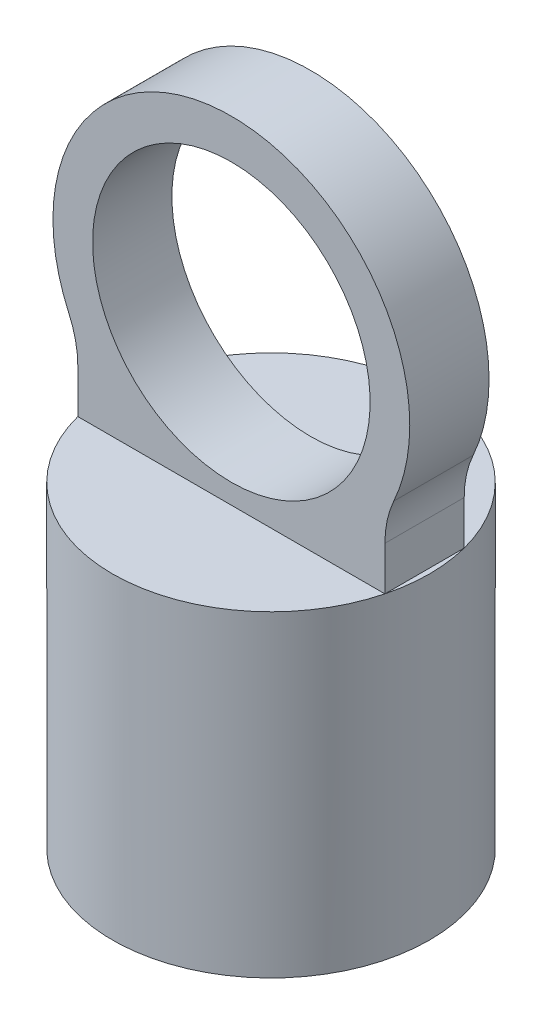
ISO-10303-21;
HEADER;
FILE_DESCRIPTION(('STEP AP214'),'2;1');
FILE_NAME('part.step','',(''),(''),'','','');
FILE_SCHEMA(('AUTOMOTIVE_DESIGN { 1 0 10303 214 1 1 1 1 }'));
ENDSEC;
DATA;
#1=APPLICATION_CONTEXT('core data for automotive mechanical design processes');
#2=APPLICATION_PROTOCOL_DEFINITION('international standard','automotive_design',2000,#1);
#3=PRODUCT_CONTEXT('',#1,'mechanical');
#4=PRODUCT('Part','Part','',(#3));
#5=PRODUCT_RELATED_PRODUCT_CATEGORY('part','',(#4));
#6=PRODUCT_DEFINITION_FORMATION('','',#4);
#7=PRODUCT_DEFINITION_CONTEXT('part definition',#1,'design');
#8=PRODUCT_DEFINITION('design','',#6,#7);
#9=PRODUCT_DEFINITION_SHAPE('','',#8);
#10=(LENGTH_UNIT() NAMED_UNIT(*) SI_UNIT(.MILLI.,.METRE.));
#11=(NAMED_UNIT(*) PLANE_ANGLE_UNIT() SI_UNIT($,.RADIAN.));
#12=(NAMED_UNIT(*) SI_UNIT($,.STERADIAN.) SOLID_ANGLE_UNIT());
#13=UNCERTAINTY_MEASURE_WITH_UNIT(LENGTH_MEASURE(1.E-05),#10,'distance_accuracy_value','');
#14=(GEOMETRIC_REPRESENTATION_CONTEXT(3) GLOBAL_UNCERTAINTY_ASSIGNED_CONTEXT((#13)) GLOBAL_UNIT_ASSIGNED_CONTEXT((#10,
#11,#12)) REPRESENTATION_CONTEXT('',''));
#15=CARTESIAN_POINT('',(0.,0.,0.));
#16=DIRECTION('',(0.,0.,1.));
#17=DIRECTION('',(1.,0.,0.));
#18=AXIS2_PLACEMENT_3D('',#15,#16,#17);
#19=CARTESIAN_POINT('',(2.75,0.,0.));
#20=DIRECTION('',(0.,-1.,0.));
#21=DIRECTION('',(0.,0.,-1.));
#22=AXIS2_PLACEMENT_3D('',#19,#20,#21);
#23=PLANE('',#22);
#24=CARTESIAN_POINT('',(0.,0.,0.));
#25=DIRECTION('',(0.,-1.,0.));
#26=DIRECTION('',(1.,0.,0.));
#27=AXIS2_PLACEMENT_3D('',#24,#25,#26);
#28=CIRCLE('',#27,5.5);
#29=CARTESIAN_POINT('',(5.5,0.,0.));
#30=VERTEX_POINT('',#29);
#31=EDGE_CURVE('E20',#30,#30,#28,.T.);
#32=ORIENTED_EDGE('',*,*,#31,.T.);
#33=EDGE_LOOP('',(#32));
#34=FACE_BOUND('',#33,.T.);
#35=ADVANCED_FACE('F17',(#34),#23,.T.);
#36=CARTESIAN_POINT('',(12.7459666924148,5.20859834963491,2.));
#37=DIRECTION('',(0.,0.,-1.));
#38=DIRECTION('',(0.,1.,0.));
#39=AXIS2_PLACEMENT_3D('',#36,#37,#38);
#40=CYLINDRICAL_SURFACE('',#39,5.);
#41=DIRECTION('',(0.,0.,1.));
#42=VECTOR('',#41,1.);
#43=CARTESIAN_POINT('',(7.74596669241484,5.20859834963492,2.));
#44=LINE('',#43,#42);
#45=CARTESIAN_POINT('',(7.74596669241484,5.20859834963491,2.));
#46=VERTEX_POINT('',#45);
#47=CARTESIAN_POINT('',(7.74596669241483,5.20859834963491,-2.));
#48=VERTEX_POINT('',#47);
#49=EDGE_CURVE('E79',#46,#48,#44,.F.);
#50=ORIENTED_EDGE('',*,*,#49,.T.);
#51=CARTESIAN_POINT('',(12.7459666924148,5.20859834963491,-2.));
#52=DIRECTION('',(0.,0.,-1.));
#53=DIRECTION('',(0.,1.,0.));
#54=AXIS2_PLACEMENT_3D('',#51,#52,#53);
#55=CIRCLE('',#54,5.);
#56=CARTESIAN_POINT('',(8.19383573083811,7.27695608190816,-2.));
#57=VERTEX_POINT('',#56);
#58=EDGE_CURVE('E84',#48,#57,#55,.T.);
#59=ORIENTED_EDGE('',*,*,#58,.T.);
#60=DIRECTION('',(0.,0.,-1.));
#61=VECTOR('',#60,1.);
#62=CARTESIAN_POINT('',(8.19383573083811,7.27695608190816,2.));
#63=LINE('',#62,#61);
#64=CARTESIAN_POINT('',(8.19383573083811,7.27695608190816,2.));
#65=VERTEX_POINT('',#64);
#66=EDGE_CURVE('E104',#65,#57,#63,.T.);
#67=ORIENTED_EDGE('',*,*,#66,.F.);
#68=CARTESIAN_POINT('',(12.7459666924148,5.20859834963491,2.));
#69=DIRECTION('',(0.,0.,-1.));
#70=DIRECTION('',(0.,1.,0.));
#71=AXIS2_PLACEMENT_3D('',#68,#69,#70);
#72=CIRCLE('',#71,5.);
#73=EDGE_CURVE('E99',#65,#46,#72,.F.);
#74=ORIENTED_EDGE('',*,*,#73,.T.);
#75=EDGE_LOOP('',(#50,#59,#67,#74));
#76=FACE_BOUND('',#75,.T.);
#77=ADVANCED_FACE('F138',(#76),#40,.F.);
#78=CARTESIAN_POINT('',(0.,11.,2.));
#79=DIRECTION('',(0.,0.,-1.));
#80=DIRECTION('',(0.,1.,0.));
#81=AXIS2_PLACEMENT_3D('',#78,#79,#80);
#82=CYLINDRICAL_SURFACE('',#81,9.);
#83=ORIENTED_EDGE('',*,*,#66,.T.);
#84=CARTESIAN_POINT('',(0.,11.,-2.));
#85=DIRECTION('',(0.,0.,-1.));
#86=DIRECTION('',(0.,1.,0.));
#87=AXIS2_PLACEMENT_3D('',#84,#85,#86);
#88=CIRCLE('',#87,9.);
#89=CARTESIAN_POINT('',(-8.19383573083811,7.27695608190815,-2.));
#90=VERTEX_POINT('',#89);
#91=EDGE_CURVE('E128',#57,#90,#88,.F.);
#92=ORIENTED_EDGE('',*,*,#91,.T.);
#93=DIRECTION('',(0.,0.,-1.));
#94=VECTOR('',#93,1.);
#95=CARTESIAN_POINT('',(-8.19383573083811,7.27695608190815,2.));
#96=LINE('',#95,#94);
#97=CARTESIAN_POINT('',(-8.19383573083811,7.27695608190815,2.));
#98=VERTEX_POINT('',#97);
#99=EDGE_CURVE('E101',#90,#98,#96,.F.);
#100=ORIENTED_EDGE('',*,*,#99,.T.);
#101=CARTESIAN_POINT('',(0.,11.,2.));
#102=DIRECTION('',(0.,0.,-1.));
#103=DIRECTION('',(0.,1.,0.));
#104=AXIS2_PLACEMENT_3D('',#101,#102,#103);
#105=CIRCLE('',#104,9.);
#106=EDGE_CURVE('E76',#98,#65,#105,.T.);
#107=ORIENTED_EDGE('',*,*,#106,.T.);
#108=EDGE_LOOP('',(#83,#92,#100,#107));
#109=FACE_BOUND('',#108,.T.);
#110=ADVANCED_FACE('F133',(#109),#82,.T.);
#111=CARTESIAN_POINT('',(-12.7459666924148,5.2085983496349,2.));
#112=DIRECTION('',(0.,0.,-1.));
#113=DIRECTION('',(0.,1.,0.));
#114=AXIS2_PLACEMENT_3D('',#111,#112,#113);
#115=CYLINDRICAL_SURFACE('',#114,5.);
#116=ORIENTED_EDGE('',*,*,#99,.F.);
#117=CARTESIAN_POINT('',(-12.7459666924148,5.2085983496349,-2.));
#118=DIRECTION('',(0.,0.,-1.));
#119=DIRECTION('',(0.,1.,0.));
#120=AXIS2_PLACEMENT_3D('',#117,#118,#119);
#121=CIRCLE('',#120,5.);
#122=CARTESIAN_POINT('',(-7.74596669241484,5.2085983496349,-2.));
#123=VERTEX_POINT('',#122);
#124=EDGE_CURVE('E83',#90,#123,#121,.T.);
#125=ORIENTED_EDGE('',*,*,#124,.T.);
#126=DIRECTION('',(0.,0.,-1.));
#127=VECTOR('',#126,1.);
#128=CARTESIAN_POINT('',(-7.74596669241484,5.2085983496349,2.));
#129=LINE('',#128,#127);
#130=CARTESIAN_POINT('',(-7.74596669241484,5.2085983496349,2.));
#131=VERTEX_POINT('',#130);
#132=EDGE_CURVE('E80',#123,#131,#129,.F.);
#133=ORIENTED_EDGE('',*,*,#132,.T.);
#134=CARTESIAN_POINT('',(-12.7459666924148,5.2085983496349,2.));
#135=DIRECTION('',(0.,0.,-1.));
#136=DIRECTION('',(0.,1.,0.));
#137=AXIS2_PLACEMENT_3D('',#134,#135,#136);
#138=CIRCLE('',#137,5.);
#139=EDGE_CURVE('E68',#131,#98,#138,.F.);
#140=ORIENTED_EDGE('',*,*,#139,.T.);
#141=EDGE_LOOP('',(#116,#125,#133,#140));
#142=FACE_BOUND('',#141,.T.);
#143=ADVANCED_FACE('F81',(#142),#115,.F.);
#144=CARTESIAN_POINT('',(0.,11.,40.5675933075855));
#145=DIRECTION('',(0.,0.,-1.));
#146=DIRECTION('',(0.,1.,0.));
#147=AXIS2_PLACEMENT_3D('',#144,#145,#146);
#148=CYLINDRICAL_SURFACE('',#147,7.);
#149=CARTESIAN_POINT('',(0.,11.,-2.));
#150=DIRECTION('',(0.,0.,-1.));
#151=DIRECTION('',(0.,1.,0.));
#152=AXIS2_PLACEMENT_3D('',#149,#150,#151);
#153=CIRCLE('',#152,7.);
#154=CARTESIAN_POINT('',(0.,18.,-2.));
#155=VERTEX_POINT('',#154);
#156=EDGE_CURVE('E123',#155,#155,#153,.T.);
#157=ORIENTED_EDGE('',*,*,#156,.T.);
#158=EDGE_LOOP('',(#157));
#159=FACE_BOUND('',#158,.T.);
#160=CARTESIAN_POINT('',(0.,11.,2.));
#161=DIRECTION('',(0.,0.,-1.));
#162=DIRECTION('',(0.,1.,0.));
#163=AXIS2_PLACEMENT_3D('',#160,#161,#162);
#164=CIRCLE('',#163,7.);
#165=CARTESIAN_POINT('',(0.,18.,2.));
#166=VERTEX_POINT('',#165);
#167=EDGE_CURVE('E90',#166,#166,#164,.F.);
#168=ORIENTED_EDGE('',*,*,#167,.T.);
#169=EDGE_LOOP('',(#168));
#170=FACE_BOUND('',#169,.T.);
#171=ADVANCED_FACE('F244',(#159,#170),#148,.F.);
#172=CARTESIAN_POINT('',(0.,-6.5,0.));
#173=DIRECTION('',(0.,-1.,0.));
#174=DIRECTION('',(1.,0.,0.));
#175=AXIS2_PLACEMENT_3D('',#172,#173,#174);
#176=CYLINDRICAL_SURFACE('',#175,5.5);
#177=CARTESIAN_POINT('',(0.,-13.,0.));
#178=DIRECTION('',(0.,-1.,0.));
#179=DIRECTION('',(1.,0.,0.));
#180=AXIS2_PLACEMENT_3D('',#177,#178,#179);
#181=CIRCLE('',#180,5.5);
#182=CARTESIAN_POINT('',(5.5,-13.,0.));
#183=VERTEX_POINT('',#182);
#184=EDGE_CURVE('E119',#183,#183,#181,.F.);
#185=ORIENTED_EDGE('',*,*,#184,.F.);
#186=EDGE_LOOP('',(#185));
#187=FACE_BOUND('',#186,.T.);
#188=ORIENTED_EDGE('',*,*,#31,.F.);
#189=EDGE_LOOP('',(#188));
#190=FACE_BOUND('',#189,.T.);
#191=ADVANCED_FACE('F237',(#187,#190),#176,.F.);
#192=CARTESIAN_POINT('',(7.74596669241484,6.41742430504417,2.));
#193=DIRECTION('',(-1.,0.,0.));
#194=DIRECTION('',(0.,0.,1.));
#195=AXIS2_PLACEMENT_3D('',#192,#193,#194);
#196=PLANE('',#195);
#197=DIRECTION('',(0.,1.,0.));
#198=VECTOR('',#197,1.);
#199=CARTESIAN_POINT('',(7.74596669241484,35.5750991517738,2.00000000000001));
#200=LINE('',#199,#198);
#201=CARTESIAN_POINT('',(7.74596669241483,3.,2.));
#202=VERTEX_POINT('',#201);
#203=EDGE_CURVE('E93',#46,#202,#200,.F.);
#204=ORIENTED_EDGE('',*,*,#203,.T.);
#205=DIRECTION('',(0.,0.,-1.));
#206=VECTOR('',#205,1.);
#207=CARTESIAN_POINT('',(7.74596669241483,3.,2.));
#208=LINE('',#207,#206);
#209=CARTESIAN_POINT('',(7.74596669241483,3.,-2.));
#210=VERTEX_POINT('',#209);
#211=EDGE_CURVE('E122',#202,#210,#208,.T.);
#212=ORIENTED_EDGE('',*,*,#211,.T.);
#213=DIRECTION('',(0.,1.,0.));
#214=VECTOR('',#213,1.);
#215=CARTESIAN_POINT('',(7.74596669241483,3.,-2.));
#216=LINE('',#215,#214);
#217=EDGE_CURVE('E126',#210,#48,#216,.T.);
#218=ORIENTED_EDGE('',*,*,#217,.T.);
#219=ORIENTED_EDGE('',*,*,#49,.F.);
#220=EDGE_LOOP('',(#204,#212,#218,#219));
#221=FACE_BOUND('',#220,.T.);
#222=ADVANCED_FACE('F141',(#221),#196,.F.);
#223=CARTESIAN_POINT('',(0.,35.5750991517738,2.00000000000001));
#224=DIRECTION('',(0.,0.,-1.));
#225=DIRECTION('',(-1.,0.,0.));
#226=AXIS2_PLACEMENT_3D('',#223,#224,#225);
#227=PLANE('',#226);
#228=ORIENTED_EDGE('',*,*,#167,.F.);
#229=EDGE_LOOP('',(#228));
#230=FACE_BOUND('',#229,.T.);
#231=ORIENTED_EDGE('',*,*,#73,.F.);
#232=ORIENTED_EDGE('',*,*,#106,.F.);
#233=ORIENTED_EDGE('',*,*,#139,.F.);
#234=DIRECTION('',(0.,1.,0.));
#235=VECTOR('',#234,1.);
#236=CARTESIAN_POINT('',(-7.74596669241484,5.,2.));
#237=LINE('',#236,#235);
#238=CARTESIAN_POINT('',(-7.74596669241483,3.,1.99999999999999));
#239=VERTEX_POINT('',#238);
#240=EDGE_CURVE('E74',#131,#239,#237,.F.);
#241=ORIENTED_EDGE('',*,*,#240,.T.);
#242=DIRECTION('',(1.,0.,0.));
#243=VECTOR('',#242,1.);
#244=CARTESIAN_POINT('',(0.,3.,2.));
#245=LINE('',#244,#243);
#246=EDGE_CURVE('E155',#239,#202,#245,.T.);
#247=ORIENTED_EDGE('',*,*,#246,.T.);
#248=ORIENTED_EDGE('',*,*,#203,.F.);
#249=EDGE_LOOP('',(#231,#232,#233,#241,#247,#248));
#250=FACE_BOUND('',#249,.T.);
#251=ADVANCED_FACE('F71',(#230,#250),#227,.F.);
#252=CARTESIAN_POINT('',(-7.74596669241484,5.,2.));
#253=DIRECTION('',(1.,0.,0.));
#254=DIRECTION('',(0.,0.,-1.));
#255=AXIS2_PLACEMENT_3D('',#252,#253,#254);
#256=PLANE('',#255);
#257=DIRECTION('',(0.,1.,0.));
#258=VECTOR('',#257,1.);
#259=CARTESIAN_POINT('',(-7.74596669241484,3.,-2.));
#260=LINE('',#259,#258);
#261=CARTESIAN_POINT('',(-7.74596669241484,3.,-2.));
#262=VERTEX_POINT('',#261);
#263=EDGE_CURVE('E35',#123,#262,#260,.F.);
#264=ORIENTED_EDGE('',*,*,#263,.T.);
#265=DIRECTION('',(0.,0.,-1.));
#266=VECTOR('',#265,1.);
#267=CARTESIAN_POINT('',(-7.74596669241483,2.99999999999999,2.));
#268=LINE('',#267,#266);
#269=EDGE_CURVE('E88',#262,#239,#268,.F.);
#270=ORIENTED_EDGE('',*,*,#269,.T.);
#271=ORIENTED_EDGE('',*,*,#240,.F.);
#272=ORIENTED_EDGE('',*,*,#132,.F.);
#273=EDGE_LOOP('',(#264,#270,#271,#272));
#274=FACE_BOUND('',#273,.T.);
#275=ADVANCED_FACE('F86',(#274),#256,.F.);
#276=CARTESIAN_POINT('',(0.,3.,-2.));
#277=DIRECTION('',(0.,0.,1.));
#278=DIRECTION('',(1.,0.,0.));
#279=AXIS2_PLACEMENT_3D('',#276,#277,#278);
#280=PLANE('',#279);
#281=ORIENTED_EDGE('',*,*,#156,.F.);
#282=EDGE_LOOP('',(#281));
#283=FACE_BOUND('',#282,.T.);
#284=DIRECTION('',(1.,0.,0.));
#285=VECTOR('',#284,1.);
#286=CARTESIAN_POINT('',(0.,3.,-2.));
#287=LINE('',#286,#285);
#288=EDGE_CURVE('E118',#210,#262,#287,.F.);
#289=ORIENTED_EDGE('',*,*,#288,.T.);
#290=ORIENTED_EDGE('',*,*,#263,.F.);
#291=ORIENTED_EDGE('',*,*,#124,.F.);
#292=ORIENTED_EDGE('',*,*,#91,.F.);
#293=ORIENTED_EDGE('',*,*,#58,.F.);
#294=ORIENTED_EDGE('',*,*,#217,.F.);
#295=EDGE_LOOP('',(#289,#290,#291,#292,#293,#294));
#296=FACE_BOUND('',#295,.T.);
#297=ADVANCED_FACE('F147',(#283,#296),#280,.F.);
#298=CARTESIAN_POINT('',(6.75,-13.,0.));
#299=DIRECTION('',(0.,-1.,0.));
#300=DIRECTION('',(0.,0.,-1.));
#301=AXIS2_PLACEMENT_3D('',#298,#299,#300);
#302=PLANE('',#301);
#303=ORIENTED_EDGE('',*,*,#184,.T.);
#304=EDGE_LOOP('',(#303));
#305=FACE_BOUND('',#304,.T.);
#306=CARTESIAN_POINT('',(0.,-13.,0.));
#307=DIRECTION('',(0.,-1.,0.));
#308=DIRECTION('',(1.,0.,0.));
#309=AXIS2_PLACEMENT_3D('',#306,#307,#308);
#310=CIRCLE('',#309,8.);
#311=CARTESIAN_POINT('',(8.,-13.,0.));
#312=VERTEX_POINT('',#311);
#313=EDGE_CURVE('E115',#312,#312,#310,.F.);
#314=ORIENTED_EDGE('',*,*,#313,.F.);
#315=EDGE_LOOP('',(#314));
#316=FACE_BOUND('',#315,.T.);
#317=ADVANCED_FACE('F169',(#305,#316),#302,.T.);
#318=CARTESIAN_POINT('',(7.74596669241483,3.,2.));
#319=DIRECTION('',(0.,-1.,0.));
#320=DIRECTION('',(0.,0.,-1.));
#321=AXIS2_PLACEMENT_3D('',#318,#319,#320);
#322=PLANE('',#321);
#323=ORIENTED_EDGE('',*,*,#211,.F.);
#324=CARTESIAN_POINT('',(0.,3.,0.));
#325=DIRECTION('',(0.,-1.,0.));
#326=DIRECTION('',(1.,0.,0.));
#327=AXIS2_PLACEMENT_3D('',#324,#325,#326);
#328=CIRCLE('',#327,8.);
#329=EDGE_CURVE('E112',#210,#202,#328,.T.);
#330=ORIENTED_EDGE('',*,*,#329,.F.);
#331=EDGE_LOOP('',(#323,#330));
#332=FACE_BOUND('',#331,.T.);
#333=ADVANCED_FACE('F167',(#332),#322,.F.);
#334=CARTESIAN_POINT('',(0.,3.,2.));
#335=DIRECTION('',(0.,-1.,0.));
#336=DIRECTION('',(0.,0.,-1.));
#337=AXIS2_PLACEMENT_3D('',#334,#335,#336);
#338=PLANE('',#337);
#339=ORIENTED_EDGE('',*,*,#246,.F.);
#340=CARTESIAN_POINT('',(0.,3.,0.));
#341=DIRECTION('',(0.,-1.,0.));
#342=DIRECTION('',(1.,0.,0.));
#343=AXIS2_PLACEMENT_3D('',#340,#341,#342);
#344=CIRCLE('',#343,8.);
#345=EDGE_CURVE('E109',#202,#239,#344,.T.);
#346=ORIENTED_EDGE('',*,*,#345,.F.);
#347=EDGE_LOOP('',(#339,#346));
#348=FACE_BOUND('',#347,.T.);
#349=ADVANCED_FACE('F163',(#348),#338,.F.);
#350=CARTESIAN_POINT('',(-13.5167192350131,2.99999999999999,2.));
#351=DIRECTION('',(0.,-1.,0.));
#352=DIRECTION('',(0.,0.,-1.));
#353=AXIS2_PLACEMENT_3D('',#350,#351,#352);
#354=PLANE('',#353);
#355=ORIENTED_EDGE('',*,*,#269,.F.);
#356=CARTESIAN_POINT('',(0.,3.,0.));
#357=DIRECTION('',(0.,-1.,0.));
#358=DIRECTION('',(1.,0.,0.));
#359=AXIS2_PLACEMENT_3D('',#356,#357,#358);
#360=CIRCLE('',#359,8.);
#361=EDGE_CURVE('E26',#239,#262,#360,.T.);
#362=ORIENTED_EDGE('',*,*,#361,.F.);
#363=EDGE_LOOP('',(#355,#362));
#364=FACE_BOUND('',#363,.T.);
#365=ADVANCED_FACE('F154',(#364),#354,.F.);
#366=CARTESIAN_POINT('',(0.,3.,-11.0167218542116));
#367=DIRECTION('',(0.,-1.,0.));
#368=DIRECTION('',(0.,0.,-1.));
#369=AXIS2_PLACEMENT_3D('',#366,#367,#368);
#370=PLANE('',#369);
#371=ORIENTED_EDGE('',*,*,#288,.F.);
#372=CARTESIAN_POINT('',(0.,3.,0.));
#373=DIRECTION('',(0.,-1.,0.));
#374=DIRECTION('',(1.,0.,0.));
#375=AXIS2_PLACEMENT_3D('',#372,#373,#374);
#376=CIRCLE('',#375,8.);
#377=EDGE_CURVE('E11',#262,#210,#376,.T.);
#378=ORIENTED_EDGE('',*,*,#377,.F.);
#379=EDGE_LOOP('',(#371,#378));
#380=FACE_BOUND('',#379,.T.);
#381=ADVANCED_FACE('F157',(#380),#370,.F.);
#382=CARTESIAN_POINT('',(0.,-4.,0.));
#383=DIRECTION('',(0.,-1.,0.));
#384=DIRECTION('',(1.,0.,0.));
#385=AXIS2_PLACEMENT_3D('',#382,#383,#384);
#386=CYLINDRICAL_SURFACE('',#385,8.);
#387=ORIENTED_EDGE('',*,*,#361,.T.);
#388=ORIENTED_EDGE('',*,*,#377,.T.);
#389=ORIENTED_EDGE('',*,*,#329,.T.);
#390=ORIENTED_EDGE('',*,*,#345,.T.);
#391=EDGE_LOOP('',(#387,#388,#389,#390));
#392=FACE_BOUND('',#391,.T.);
#393=ORIENTED_EDGE('',*,*,#313,.T.);
#394=EDGE_LOOP('',(#393));
#395=FACE_BOUND('',#394,.T.);
#396=ADVANCED_FACE('F159',(#392,#395),#386,.T.);
#397=CLOSED_SHELL('',(#35,#77,#110,#143,#171,#191,#222,#251,#275,#297,#317,#333,#349,#365,#381,#396));
#398=MANIFOLD_SOLID_BREP('B1',#397);
#399=ADVANCED_BREP_SHAPE_REPRESENTATION('',(#18,#398),#14);
#400=SHAPE_DEFINITION_REPRESENTATION(#9,#399);
ENDSEC;
END-ISO-10303-21;
